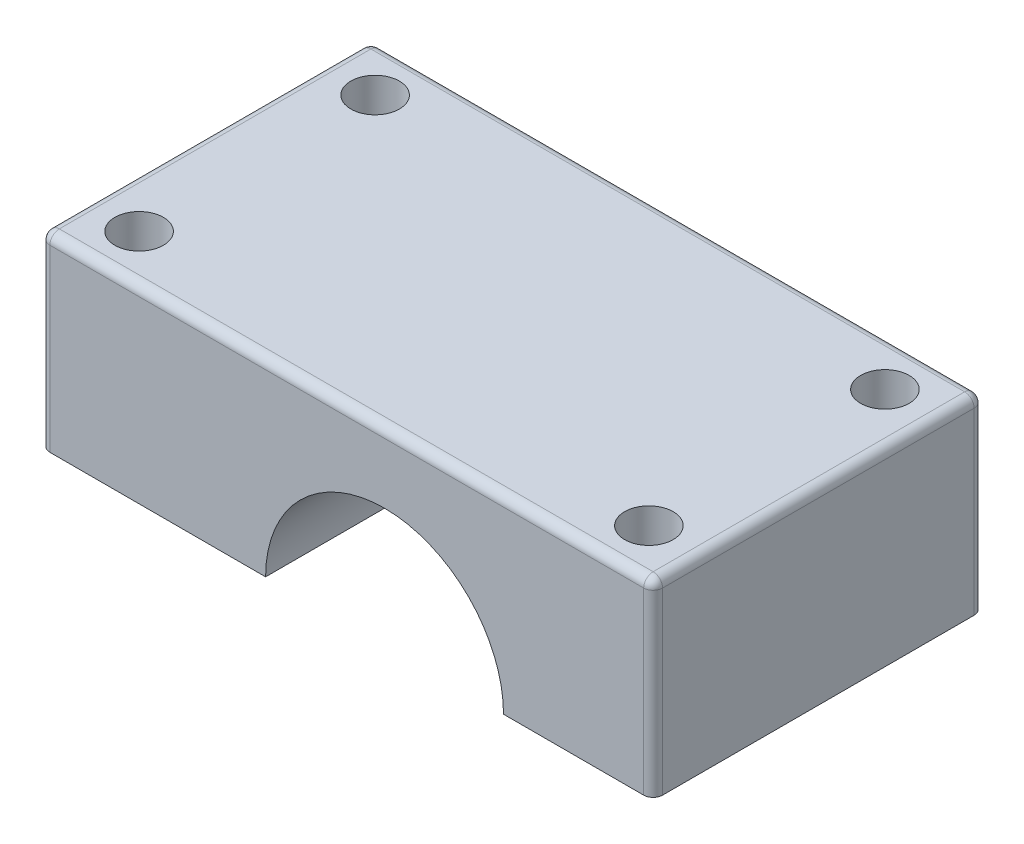
ISO-10303-21;
HEADER;
FILE_DESCRIPTION(('STEP AP214'),'2;1');
FILE_NAME('part.step','',(''),(''),'','','');
FILE_SCHEMA(('AUTOMOTIVE_DESIGN { 1 0 10303 214 1 1 1 1 }'));
ENDSEC;
DATA;
#1=APPLICATION_CONTEXT('core data for automotive mechanical design processes');
#2=APPLICATION_PROTOCOL_DEFINITION('international standard','automotive_design',2000,#1);
#3=PRODUCT_CONTEXT('',#1,'mechanical');
#4=PRODUCT('Part','Part','',(#3));
#5=PRODUCT_RELATED_PRODUCT_CATEGORY('part','',(#4));
#6=PRODUCT_DEFINITION_FORMATION('','',#4);
#7=PRODUCT_DEFINITION_CONTEXT('part definition',#1,'design');
#8=PRODUCT_DEFINITION('design','',#6,#7);
#9=PRODUCT_DEFINITION_SHAPE('','',#8);
#10=(LENGTH_UNIT() NAMED_UNIT(*) SI_UNIT(.MILLI.,.METRE.));
#11=(NAMED_UNIT(*) PLANE_ANGLE_UNIT() SI_UNIT($,.RADIAN.));
#12=(NAMED_UNIT(*) SI_UNIT($,.STERADIAN.) SOLID_ANGLE_UNIT());
#13=UNCERTAINTY_MEASURE_WITH_UNIT(LENGTH_MEASURE(1.E-05),#10,'distance_accuracy_value','');
#14=(GEOMETRIC_REPRESENTATION_CONTEXT(3) GLOBAL_UNCERTAINTY_ASSIGNED_CONTEXT((#13)) GLOBAL_UNIT_ASSIGNED_CONTEXT((#10,
#11,#12)) REPRESENTATION_CONTEXT('',''));
#15=CARTESIAN_POINT('',(0.,0.,0.));
#16=DIRECTION('',(0.,0.,1.));
#17=DIRECTION('',(1.,0.,0.));
#18=AXIS2_PLACEMENT_3D('',#15,#16,#17);
#19=CARTESIAN_POINT('',(0.,-12.7,0.));
#20=DIRECTION('',(0.,1.,0.));
#21=DIRECTION('',(0.,0.,1.));
#22=AXIS2_PLACEMENT_3D('',#19,#20,#21);
#23=PLANE('',#22);
#24=CARTESIAN_POINT('',(-39.37,-12.7,15.875));
#25=DIRECTION('',(0.,-1.,0.));
#26=DIRECTION('',(0.,0.,-1.));
#27=AXIS2_PLACEMENT_3D('',#24,#25,#26);
#28=CIRCLE('',#27,3.26389999999999);
#29=CARTESIAN_POINT('',(-39.37,-12.7,12.6111));
#30=VERTEX_POINT('',#29);
#31=EDGE_CURVE('E227',#30,#30,#28,.T.);
#32=ORIENTED_EDGE('',*,*,#31,.F.);
#33=EDGE_LOOP('',(#32));
#34=FACE_BOUND('',#33,.T.);
#35=CARTESIAN_POINT('',(-39.37,-12.7,-15.875));
#36=DIRECTION('',(0.,-1.,0.));
#37=DIRECTION('',(0.,0.,-1.));
#38=AXIS2_PLACEMENT_3D('',#35,#36,#37);
#39=CIRCLE('',#38,3.26389999999999);
#40=CARTESIAN_POINT('',(-39.37,-12.7,-19.1389));
#41=VERTEX_POINT('',#40);
#42=EDGE_CURVE('E251',#41,#41,#39,.T.);
#43=ORIENTED_EDGE('',*,*,#42,.F.);
#44=EDGE_LOOP('',(#43));
#45=FACE_BOUND('',#44,.T.);
#46=DIRECTION('',(0.,0.,1.));
#47=VECTOR('',#46,1.);
#48=CARTESIAN_POINT('',(-46.2915,-12.7,-22.225));
#49=LINE('',#48,#47);
#50=CARTESIAN_POINT('',(-46.2915,-12.7,-20.955));
#51=VERTEX_POINT('',#50);
#52=CARTESIAN_POINT('',(-46.2915,-12.7,20.955));
#53=VERTEX_POINT('',#52);
#54=EDGE_CURVE('E257',#51,#53,#49,.T.);
#55=ORIENTED_EDGE('',*,*,#54,.F.);
#56=CARTESIAN_POINT('',(-45.0215,-12.7,-20.955));
#57=DIRECTION('',(0.,1.,0.));
#58=DIRECTION('',(0.,0.,1.));
#59=AXIS2_PLACEMENT_3D('',#56,#57,#58);
#60=CIRCLE('',#59,1.27);
#61=CARTESIAN_POINT('',(-45.0215,-12.7,-22.225));
#62=VERTEX_POINT('',#61);
#63=EDGE_CURVE('E149',#51,#62,#60,.F.);
#64=ORIENTED_EDGE('',*,*,#63,.T.);
#65=DIRECTION('',(-1.,0.,0.));
#66=VECTOR('',#65,1.);
#67=CARTESIAN_POINT('',(-36.1315,-12.7,-22.225));
#68=LINE('',#67,#66);
#69=CARTESIAN_POINT('',(-16.002,-12.7,-22.225));
#70=VERTEX_POINT('',#69);
#71=EDGE_CURVE('E141',#70,#62,#68,.T.);
#72=ORIENTED_EDGE('',*,*,#71,.F.);
#73=DIRECTION('',(0.,0.,1.));
#74=VECTOR('',#73,1.);
#75=CARTESIAN_POINT('',(-16.002,-12.7,-22.225));
#76=LINE('',#75,#74);
#77=CARTESIAN_POINT('',(-16.002,-12.7,22.225));
#78=VERTEX_POINT('',#77);
#79=EDGE_CURVE('E126',#70,#78,#76,.T.);
#80=ORIENTED_EDGE('',*,*,#79,.T.);
#81=DIRECTION('',(1.,0.,0.));
#82=VECTOR('',#81,1.);
#83=CARTESIAN_POINT('',(-36.1315,-12.7,22.225));
#84=LINE('',#83,#82);
#85=CARTESIAN_POINT('',(-45.0215,-12.7,22.225));
#86=VERTEX_POINT('',#85);
#87=EDGE_CURVE('E156',#86,#78,#84,.T.);
#88=ORIENTED_EDGE('',*,*,#87,.F.);
#89=CARTESIAN_POINT('',(-45.0215,-12.7,20.955));
#90=DIRECTION('',(0.,1.,0.));
#91=DIRECTION('',(0.,0.,1.));
#92=AXIS2_PLACEMENT_3D('',#89,#90,#91);
#93=CIRCLE('',#92,1.27);
#94=EDGE_CURVE('E180',#86,#53,#93,.F.);
#95=ORIENTED_EDGE('',*,*,#94,.T.);
#96=EDGE_LOOP('',(#55,#64,#72,#80,#88,#95));
#97=FACE_BOUND('',#96,.T.);
#98=ADVANCED_FACE('F34',(#34,#45,#97),#23,.F.);
#99=CARTESIAN_POINT('',(36.1315,12.7,-22.225));
#100=DIRECTION('',(-1.,0.,0.));
#101=DIRECTION('',(0.,0.,1.));
#102=AXIS2_PLACEMENT_3D('',#99,#100,#101);
#103=PLANE('',#102);
#104=DIRECTION('',(0.,0.,-1.));
#105=VECTOR('',#104,1.);
#106=CARTESIAN_POINT('',(36.1315,-12.7,-22.225));
#107=LINE('',#106,#105);
#108=CARTESIAN_POINT('',(36.1315,-12.7,20.955));
#109=VERTEX_POINT('',#108);
#110=CARTESIAN_POINT('',(36.1315,-12.7,-20.955));
#111=VERTEX_POINT('',#110);
#112=EDGE_CURVE('E150',#109,#111,#107,.T.);
#113=ORIENTED_EDGE('',*,*,#112,.T.);
#114=DIRECTION('',(0.,-1.,0.));
#115=VECTOR('',#114,1.);
#116=CARTESIAN_POINT('',(36.1315,12.7,-20.955));
#117=LINE('',#116,#115);
#118=CARTESIAN_POINT('',(36.1315,11.43,-20.955));
#119=VERTEX_POINT('',#118);
#120=EDGE_CURVE('E172',#111,#119,#117,.F.);
#121=ORIENTED_EDGE('',*,*,#120,.T.);
#122=DIRECTION('',(0.,0.,-1.));
#123=VECTOR('',#122,1.);
#124=CARTESIAN_POINT('',(36.1315,11.43,22.225));
#125=LINE('',#124,#123);
#126=CARTESIAN_POINT('',(36.1315,11.43,20.955));
#127=VERTEX_POINT('',#126);
#128=EDGE_CURVE('E168',#119,#127,#125,.F.);
#129=ORIENTED_EDGE('',*,*,#128,.T.);
#130=DIRECTION('',(0.,-1.,0.));
#131=VECTOR('',#130,1.);
#132=CARTESIAN_POINT('',(36.1315,12.7,20.955));
#133=LINE('',#132,#131);
#134=EDGE_CURVE('E170',#127,#109,#133,.T.);
#135=ORIENTED_EDGE('',*,*,#134,.T.);
#136=EDGE_LOOP('',(#113,#121,#129,#135));
#137=FACE_BOUND('',#136,.T.);
#138=ADVANCED_FACE('F307',(#137),#103,.F.);
#139=CARTESIAN_POINT('',(-36.1315,12.7,-22.225));
#140=DIRECTION('',(0.,0.,1.));
#141=DIRECTION('',(1.,0.,0.));
#142=AXIS2_PLACEMENT_3D('',#139,#140,#141);
#143=PLANE('',#142);
#144=DIRECTION('',(-1.,0.,0.));
#145=VECTOR('',#144,1.);
#146=CARTESIAN_POINT('',(36.1315,11.43,-22.225));
#147=LINE('',#146,#145);
#148=CARTESIAN_POINT('',(-45.0215,11.43,-22.225));
#149=VERTEX_POINT('',#148);
#150=CARTESIAN_POINT('',(34.8615,11.43,-22.225));
#151=VERTEX_POINT('',#150);
#152=EDGE_CURVE('E158',#149,#151,#147,.F.);
#153=ORIENTED_EDGE('',*,*,#152,.T.);
#154=DIRECTION('',(0.,-1.,0.));
#155=VECTOR('',#154,1.);
#156=CARTESIAN_POINT('',(34.8615,12.7,-22.225));
#157=LINE('',#156,#155);
#158=CARTESIAN_POINT('',(34.8615,-12.7,-22.225));
#159=VERTEX_POINT('',#158);
#160=EDGE_CURVE('E162',#151,#159,#157,.T.);
#161=ORIENTED_EDGE('',*,*,#160,.T.);
#162=CARTESIAN_POINT('',(16.002,-12.7,-22.225));
#163=VERTEX_POINT('',#162);
#164=EDGE_CURVE('E145',#159,#163,#68,.T.);
#165=ORIENTED_EDGE('',*,*,#164,.T.);
#166=CARTESIAN_POINT('',(0.,-12.7,-22.225));
#167=DIRECTION('',(0.,0.,1.));
#168=DIRECTION('',(-1.,0.,0.));
#169=AXIS2_PLACEMENT_3D('',#166,#167,#168);
#170=CIRCLE('',#169,16.002);
#171=EDGE_CURVE('E129',#163,#70,#170,.T.);
#172=ORIENTED_EDGE('',*,*,#171,.T.);
#173=ORIENTED_EDGE('',*,*,#71,.T.);
#174=DIRECTION('',(0.,-1.,0.));
#175=VECTOR('',#174,1.);
#176=CARTESIAN_POINT('',(-45.0215,12.7,-22.225));
#177=LINE('',#176,#175);
#178=EDGE_CURVE('E160',#62,#149,#177,.F.);
#179=ORIENTED_EDGE('',*,*,#178,.T.);
#180=EDGE_LOOP('',(#153,#161,#165,#172,#173,#179));
#181=FACE_BOUND('',#180,.T.);
#182=ADVANCED_FACE('F140',(#181),#143,.F.);
#183=CARTESIAN_POINT('',(-36.1315,12.7,22.225));
#184=DIRECTION('',(0.,0.,-1.));
#185=DIRECTION('',(-1.,0.,0.));
#186=AXIS2_PLACEMENT_3D('',#183,#184,#185);
#187=PLANE('',#186);
#188=DIRECTION('',(1.,0.,0.));
#189=VECTOR('',#188,1.);
#190=CARTESIAN_POINT('',(-46.2915,11.43,22.225));
#191=LINE('',#190,#189);
#192=CARTESIAN_POINT('',(34.8615,11.43,22.225));
#193=VERTEX_POINT('',#192);
#194=CARTESIAN_POINT('',(-45.0215,11.43,22.225));
#195=VERTEX_POINT('',#194);
#196=EDGE_CURVE('E183',#193,#195,#191,.F.);
#197=ORIENTED_EDGE('',*,*,#196,.T.);
#198=DIRECTION('',(0.,1.,0.));
#199=VECTOR('',#198,1.);
#200=CARTESIAN_POINT('',(-45.0215,-12.7,22.225));
#201=LINE('',#200,#199);
#202=EDGE_CURVE('E187',#195,#86,#201,.F.);
#203=ORIENTED_EDGE('',*,*,#202,.T.);
#204=ORIENTED_EDGE('',*,*,#87,.T.);
#205=CARTESIAN_POINT('',(0.,-12.7,22.225));
#206=DIRECTION('',(0.,0.,1.));
#207=DIRECTION('',(-1.,0.,0.));
#208=AXIS2_PLACEMENT_3D('',#205,#206,#207);
#209=CIRCLE('',#208,16.002);
#210=CARTESIAN_POINT('',(16.002,-12.7,22.225));
#211=VERTEX_POINT('',#210);
#212=EDGE_CURVE('E132',#211,#78,#209,.T.);
#213=ORIENTED_EDGE('',*,*,#212,.F.);
#214=CARTESIAN_POINT('',(34.8615,-12.7,22.225));
#215=VERTEX_POINT('',#214);
#216=EDGE_CURVE('E152',#211,#215,#84,.T.);
#217=ORIENTED_EDGE('',*,*,#216,.T.);
#218=DIRECTION('',(0.,-1.,0.));
#219=VECTOR('',#218,1.);
#220=CARTESIAN_POINT('',(34.8615,12.7,22.225));
#221=LINE('',#220,#219);
#222=EDGE_CURVE('E185',#215,#193,#221,.F.);
#223=ORIENTED_EDGE('',*,*,#222,.T.);
#224=EDGE_LOOP('',(#197,#203,#204,#213,#217,#223));
#225=FACE_BOUND('',#224,.T.);
#226=ADVANCED_FACE('F265',(#225),#187,.F.);
#227=CARTESIAN_POINT('',(0.,12.7,0.));
#228=DIRECTION('',(0.,1.,0.));
#229=DIRECTION('',(0.,0.,1.));
#230=AXIS2_PLACEMENT_3D('',#227,#228,#229);
#231=PLANE('',#230);
#232=DIRECTION('',(0.,0.,-1.));
#233=VECTOR('',#232,1.);
#234=CARTESIAN_POINT('',(34.8615,12.7,-22.225));
#235=LINE('',#234,#233);
#236=CARTESIAN_POINT('',(34.8615,12.7,20.955));
#237=VERTEX_POINT('',#236);
#238=CARTESIAN_POINT('',(34.8615,12.7,-20.955));
#239=VERTEX_POINT('',#238);
#240=EDGE_CURVE('E43',#237,#239,#235,.T.);
#241=ORIENTED_EDGE('',*,*,#240,.T.);
#242=DIRECTION('',(-1.,0.,0.));
#243=VECTOR('',#242,1.);
#244=CARTESIAN_POINT('',(-46.2915,12.7,-20.955));
#245=LINE('',#244,#243);
#246=CARTESIAN_POINT('',(-45.0215,12.7,-20.955));
#247=VERTEX_POINT('',#246);
#248=EDGE_CURVE('E11',#239,#247,#245,.T.);
#249=ORIENTED_EDGE('',*,*,#248,.T.);
#250=DIRECTION('',(0.,0.,-1.));
#251=VECTOR('',#250,1.);
#252=CARTESIAN_POINT('',(-45.0215,12.7,0.));
#253=LINE('',#252,#251);
#254=CARTESIAN_POINT('',(-45.0215,12.7,20.955));
#255=VERTEX_POINT('',#254);
#256=EDGE_CURVE('E191',#247,#255,#253,.F.);
#257=ORIENTED_EDGE('',*,*,#256,.T.);
#258=DIRECTION('',(1.,0.,0.));
#259=VECTOR('',#258,1.);
#260=CARTESIAN_POINT('',(36.1315,12.7,20.955));
#261=LINE('',#260,#259);
#262=EDGE_CURVE('E189',#255,#237,#261,.T.);
#263=ORIENTED_EDGE('',*,*,#262,.T.);
#264=EDGE_LOOP('',(#241,#249,#257,#263));
#265=FACE_BOUND('',#264,.T.);
#266=CARTESIAN_POINT('',(-39.37,12.7,15.875));
#267=DIRECTION('',(0.,-1.,0.));
#268=DIRECTION('',(0.,0.,-1.));
#269=AXIS2_PLACEMENT_3D('',#266,#267,#268);
#270=CIRCLE('',#269,3.26389999999999);
#271=CARTESIAN_POINT('',(-39.37,12.7,12.6111));
#272=VERTEX_POINT('',#271);
#273=EDGE_CURVE('E232',#272,#272,#270,.T.);
#274=ORIENTED_EDGE('',*,*,#273,.T.);
#275=EDGE_LOOP('',(#274));
#276=FACE_BOUND('',#275,.T.);
#277=CARTESIAN_POINT('',(29.21,12.7,15.875));
#278=DIRECTION('',(0.,-1.,0.));
#279=DIRECTION('',(0.,0.,-1.));
#280=AXIS2_PLACEMENT_3D('',#277,#278,#279);
#281=CIRCLE('',#280,3.26389999999999);
#282=CARTESIAN_POINT('',(29.21,12.7,12.6111));
#283=VERTEX_POINT('',#282);
#284=EDGE_CURVE('E242',#283,#283,#281,.T.);
#285=ORIENTED_EDGE('',*,*,#284,.T.);
#286=EDGE_LOOP('',(#285));
#287=FACE_BOUND('',#286,.T.);
#288=CARTESIAN_POINT('',(29.21,12.7,-15.875));
#289=DIRECTION('',(0.,-1.,0.));
#290=DIRECTION('',(0.,0.,-1.));
#291=AXIS2_PLACEMENT_3D('',#288,#289,#290);
#292=CIRCLE('',#291,3.26389999999999);
#293=CARTESIAN_POINT('',(29.21,12.7,-19.1389));
#294=VERTEX_POINT('',#293);
#295=EDGE_CURVE('E248',#294,#294,#292,.T.);
#296=ORIENTED_EDGE('',*,*,#295,.T.);
#297=EDGE_LOOP('',(#296));
#298=FACE_BOUND('',#297,.T.);
#299=CARTESIAN_POINT('',(-39.37,12.7,-15.875));
#300=DIRECTION('',(0.,-1.,0.));
#301=DIRECTION('',(0.,0.,-1.));
#302=AXIS2_PLACEMENT_3D('',#299,#300,#301);
#303=CIRCLE('',#302,3.26389999999999);
#304=CARTESIAN_POINT('',(-39.37,12.7,-19.1389));
#305=VERTEX_POINT('',#304);
#306=EDGE_CURVE('E254',#305,#305,#303,.T.);
#307=ORIENTED_EDGE('',*,*,#306,.T.);
#308=EDGE_LOOP('',(#307));
#309=FACE_BOUND('',#308,.T.);
#310=ADVANCED_FACE('F290',(#265,#276,#287,#298,#309),#231,.T.);
#311=CARTESIAN_POINT('',(29.21,-12.7,15.875));
#312=DIRECTION('',(0.,-1.,0.));
#313=DIRECTION('',(0.,0.,-1.));
#314=AXIS2_PLACEMENT_3D('',#311,#312,#313);
#315=CIRCLE('',#314,3.26389999999999);
#316=CARTESIAN_POINT('',(29.21,-12.7,12.6111));
#317=VERTEX_POINT('',#316);
#318=EDGE_CURVE('E237',#317,#317,#315,.T.);
#319=ORIENTED_EDGE('',*,*,#318,.F.);
#320=EDGE_LOOP('',(#319));
#321=FACE_BOUND('',#320,.T.);
#322=CARTESIAN_POINT('',(29.21,-12.7,-15.875));
#323=DIRECTION('',(0.,-1.,0.));
#324=DIRECTION('',(0.,0.,-1.));
#325=AXIS2_PLACEMENT_3D('',#322,#323,#324);
#326=CIRCLE('',#325,3.26389999999999);
#327=CARTESIAN_POINT('',(29.21,-12.7,-19.1389));
#328=VERTEX_POINT('',#327);
#329=EDGE_CURVE('E245',#328,#328,#326,.T.);
#330=ORIENTED_EDGE('',*,*,#329,.F.);
#331=EDGE_LOOP('',(#330));
#332=FACE_BOUND('',#331,.T.);
#333=ORIENTED_EDGE('',*,*,#164,.F.);
#334=CARTESIAN_POINT('',(34.8615,-12.7,-20.955));
#335=DIRECTION('',(0.,1.,0.));
#336=DIRECTION('',(0.,0.,1.));
#337=AXIS2_PLACEMENT_3D('',#334,#335,#336);
#338=CIRCLE('',#337,1.27);
#339=EDGE_CURVE('E166',#159,#111,#338,.F.);
#340=ORIENTED_EDGE('',*,*,#339,.T.);
#341=ORIENTED_EDGE('',*,*,#112,.F.);
#342=CARTESIAN_POINT('',(34.8615,-12.7,20.955));
#343=DIRECTION('',(0.,1.,0.));
#344=DIRECTION('',(0.,0.,1.));
#345=AXIS2_PLACEMENT_3D('',#342,#343,#344);
#346=CIRCLE('',#345,1.27);
#347=EDGE_CURVE('E164',#109,#215,#346,.F.);
#348=ORIENTED_EDGE('',*,*,#347,.T.);
#349=ORIENTED_EDGE('',*,*,#216,.F.);
#350=DIRECTION('',(0.,0.,1.));
#351=VECTOR('',#350,1.);
#352=CARTESIAN_POINT('',(16.002,-12.7,-22.225));
#353=LINE('',#352,#351);
#354=EDGE_CURVE('E136',#163,#211,#353,.T.);
#355=ORIENTED_EDGE('',*,*,#354,.F.);
#356=EDGE_LOOP('',(#333,#340,#341,#348,#349,#355));
#357=FACE_BOUND('',#356,.T.);
#358=ADVANCED_FACE('F267',(#321,#332,#357),#23,.F.);
#359=CARTESIAN_POINT('',(0.,-12.7,-22.225));
#360=DIRECTION('',(0.,0.,1.));
#361=DIRECTION('',(1.,0.,0.));
#362=AXIS2_PLACEMENT_3D('',#359,#360,#361);
#363=CYLINDRICAL_SURFACE('',#362,16.002);
#364=ORIENTED_EDGE('',*,*,#212,.T.);
#365=ORIENTED_EDGE('',*,*,#79,.F.);
#366=ORIENTED_EDGE('',*,*,#171,.F.);
#367=ORIENTED_EDGE('',*,*,#354,.T.);
#368=EDGE_LOOP('',(#364,#365,#366,#367));
#369=FACE_BOUND('',#368,.T.);
#370=ADVANCED_FACE('F128',(#369),#363,.F.);
#371=CARTESIAN_POINT('',(-46.2915,0.,0.));
#372=DIRECTION('',(-1.,0.,0.));
#373=DIRECTION('',(0.,0.,1.));
#374=AXIS2_PLACEMENT_3D('',#371,#372,#373);
#375=PLANE('',#374);
#376=DIRECTION('',(0.,0.,-1.));
#377=VECTOR('',#376,1.);
#378=CARTESIAN_POINT('',(-46.2915,11.43,0.));
#379=LINE('',#378,#377);
#380=CARTESIAN_POINT('',(-46.2915,11.43,20.955));
#381=VERTEX_POINT('',#380);
#382=CARTESIAN_POINT('',(-46.2915,11.43,-20.955));
#383=VERTEX_POINT('',#382);
#384=EDGE_CURVE('E174',#381,#383,#379,.T.);
#385=ORIENTED_EDGE('',*,*,#384,.T.);
#386=DIRECTION('',(0.,-1.,0.));
#387=VECTOR('',#386,1.);
#388=CARTESIAN_POINT('',(-46.2915,-12.7,-20.955));
#389=LINE('',#388,#387);
#390=EDGE_CURVE('E178',#383,#51,#389,.T.);
#391=ORIENTED_EDGE('',*,*,#390,.T.);
#392=ORIENTED_EDGE('',*,*,#54,.T.);
#393=DIRECTION('',(0.,1.,0.));
#394=VECTOR('',#393,1.);
#395=CARTESIAN_POINT('',(-46.2915,12.7,20.955));
#396=LINE('',#395,#394);
#397=EDGE_CURVE('E176',#53,#381,#396,.T.);
#398=ORIENTED_EDGE('',*,*,#397,.T.);
#399=EDGE_LOOP('',(#385,#391,#392,#398));
#400=FACE_BOUND('',#399,.T.);
#401=ADVANCED_FACE('F324',(#400),#375,.T.);
#402=CARTESIAN_POINT('',(-39.37,-12.7,-15.875));
#403=DIRECTION('',(0.,-1.,0.));
#404=DIRECTION('',(0.,0.,-1.));
#405=AXIS2_PLACEMENT_3D('',#402,#403,#404);
#406=CYLINDRICAL_SURFACE('',#405,3.26389999999999);
#407=ORIENTED_EDGE('',*,*,#306,.F.);
#408=EDGE_LOOP('',(#407));
#409=FACE_BOUND('',#408,.T.);
#410=ORIENTED_EDGE('',*,*,#42,.T.);
#411=EDGE_LOOP('',(#410));
#412=FACE_BOUND('',#411,.T.);
#413=ADVANCED_FACE('F333',(#409,#412),#406,.F.);
#414=CARTESIAN_POINT('',(29.21,-12.7,-15.875));
#415=DIRECTION('',(0.,-1.,0.));
#416=DIRECTION('',(0.,0.,-1.));
#417=AXIS2_PLACEMENT_3D('',#414,#415,#416);
#418=CYLINDRICAL_SURFACE('',#417,3.26389999999999);
#419=ORIENTED_EDGE('',*,*,#295,.F.);
#420=EDGE_LOOP('',(#419));
#421=FACE_BOUND('',#420,.T.);
#422=ORIENTED_EDGE('',*,*,#329,.T.);
#423=EDGE_LOOP('',(#422));
#424=FACE_BOUND('',#423,.T.);
#425=ADVANCED_FACE('F330',(#421,#424),#418,.F.);
#426=CARTESIAN_POINT('',(29.21,-12.7,15.875));
#427=DIRECTION('',(0.,-1.,0.));
#428=DIRECTION('',(0.,0.,-1.));
#429=AXIS2_PLACEMENT_3D('',#426,#427,#428);
#430=CYLINDRICAL_SURFACE('',#429,3.26389999999999);
#431=ORIENTED_EDGE('',*,*,#284,.F.);
#432=EDGE_LOOP('',(#431));
#433=FACE_BOUND('',#432,.T.);
#434=ORIENTED_EDGE('',*,*,#318,.T.);
#435=EDGE_LOOP('',(#434));
#436=FACE_BOUND('',#435,.T.);
#437=ADVANCED_FACE('F332',(#433,#436),#430,.F.);
#438=CARTESIAN_POINT('',(-39.37,-12.7,15.875));
#439=DIRECTION('',(0.,-1.,0.));
#440=DIRECTION('',(0.,0.,-1.));
#441=AXIS2_PLACEMENT_3D('',#438,#439,#440);
#442=CYLINDRICAL_SURFACE('',#441,3.26389999999999);
#443=ORIENTED_EDGE('',*,*,#273,.F.);
#444=EDGE_LOOP('',(#443));
#445=FACE_BOUND('',#444,.T.);
#446=ORIENTED_EDGE('',*,*,#31,.T.);
#447=EDGE_LOOP('',(#446));
#448=FACE_BOUND('',#447,.T.);
#449=ADVANCED_FACE('F304',(#445,#448),#442,.F.);
#450=CARTESIAN_POINT('',(-45.0215,0.,20.955));
#451=DIRECTION('',(0.,-1.,0.));
#452=DIRECTION('',(0.,0.,-1.));
#453=AXIS2_PLACEMENT_3D('',#450,#451,#452);
#454=CYLINDRICAL_SURFACE('',#453,1.27);
#455=CARTESIAN_POINT('',(-45.0215,11.43,20.955));
#456=DIRECTION('',(0.,1.,0.));
#457=DIRECTION('',(0.,0.,1.));
#458=AXIS2_PLACEMENT_3D('',#455,#456,#457);
#459=CIRCLE('',#458,1.27);
#460=EDGE_CURVE('E38',#381,#195,#459,.T.);
#461=ORIENTED_EDGE('',*,*,#460,.F.);
#462=ORIENTED_EDGE('',*,*,#397,.F.);
#463=ORIENTED_EDGE('',*,*,#94,.F.);
#464=ORIENTED_EDGE('',*,*,#202,.F.);
#465=EDGE_LOOP('',(#461,#462,#463,#464));
#466=FACE_BOUND('',#465,.T.);
#467=ADVANCED_FACE('F36',(#466),#454,.T.);
#468=CARTESIAN_POINT('',(-45.0215,11.43,20.955));
#469=DIRECTION('',(0.,0.,1.));
#470=DIRECTION('',(1.,0.,0.));
#471=AXIS2_PLACEMENT_3D('',#468,#469,#470);
#472=SPHERICAL_SURFACE('',#471,1.27);
#473=CARTESIAN_POINT('',(-45.0215,11.43,20.955));
#474=DIRECTION('',(0.,0.,1.));
#475=DIRECTION('',(1.,0.,0.));
#476=AXIS2_PLACEMENT_3D('',#473,#474,#475);
#477=CIRCLE('',#476,1.27);
#478=EDGE_CURVE('E218',#381,#255,#477,.F.);
#479=ORIENTED_EDGE('',*,*,#478,.F.);
#480=ORIENTED_EDGE('',*,*,#460,.T.);
#481=CARTESIAN_POINT('',(-45.0215,11.43,20.955));
#482=DIRECTION('',(-1.,0.,0.));
#483=DIRECTION('',(0.,0.,1.));
#484=AXIS2_PLACEMENT_3D('',#481,#482,#483);
#485=CIRCLE('',#484,1.27);
#486=EDGE_CURVE('E220',#255,#195,#485,.F.);
#487=ORIENTED_EDGE('',*,*,#486,.F.);
#488=EDGE_LOOP('',(#479,#480,#487));
#489=FACE_BOUND('',#488,.T.);
#490=ADVANCED_FACE('F297',(#489),#472,.T.);
#491=CARTESIAN_POINT('',(34.8615,12.7,20.955));
#492=DIRECTION('',(0.,-1.,0.));
#493=DIRECTION('',(0.,0.,-1.));
#494=AXIS2_PLACEMENT_3D('',#491,#492,#493);
#495=CYLINDRICAL_SURFACE('',#494,1.27);
#496=ORIENTED_EDGE('',*,*,#347,.F.);
#497=ORIENTED_EDGE('',*,*,#134,.F.);
#498=CARTESIAN_POINT('',(34.8615,11.43,20.955));
#499=DIRECTION('',(0.,1.,0.));
#500=DIRECTION('',(0.,0.,1.));
#501=AXIS2_PLACEMENT_3D('',#498,#499,#500);
#502=CIRCLE('',#501,1.27);
#503=EDGE_CURVE('E215',#193,#127,#502,.T.);
#504=ORIENTED_EDGE('',*,*,#503,.F.);
#505=ORIENTED_EDGE('',*,*,#222,.F.);
#506=EDGE_LOOP('',(#496,#497,#504,#505));
#507=FACE_BOUND('',#506,.T.);
#508=ADVANCED_FACE('F272',(#507),#495,.T.);
#509=CARTESIAN_POINT('',(0.,11.43,20.955));
#510=DIRECTION('',(-1.,0.,0.));
#511=DIRECTION('',(0.,0.,1.));
#512=AXIS2_PLACEMENT_3D('',#509,#510,#511);
#513=CYLINDRICAL_SURFACE('',#512,1.27);
#514=ORIENTED_EDGE('',*,*,#486,.T.);
#515=ORIENTED_EDGE('',*,*,#196,.F.);
#516=CARTESIAN_POINT('',(34.8615,11.43,20.955));
#517=DIRECTION('',(1.,0.,0.));
#518=DIRECTION('',(0.,0.,-1.));
#519=AXIS2_PLACEMENT_3D('',#516,#517,#518);
#520=CIRCLE('',#519,1.27);
#521=EDGE_CURVE('E212',#237,#193,#520,.T.);
#522=ORIENTED_EDGE('',*,*,#521,.F.);
#523=ORIENTED_EDGE('',*,*,#262,.F.);
#524=EDGE_LOOP('',(#514,#515,#522,#523));
#525=FACE_BOUND('',#524,.T.);
#526=ADVANCED_FACE('F276',(#525),#513,.T.);
#527=CARTESIAN_POINT('',(-45.0215,11.43,0.));
#528=DIRECTION('',(0.,0.,-1.));
#529=DIRECTION('',(-1.,0.,0.));
#530=AXIS2_PLACEMENT_3D('',#527,#528,#529);
#531=CYLINDRICAL_SURFACE('',#530,1.27);
#532=ORIENTED_EDGE('',*,*,#478,.T.);
#533=ORIENTED_EDGE('',*,*,#256,.F.);
#534=CARTESIAN_POINT('',(-45.0215,11.43,-20.955));
#535=DIRECTION('',(0.,0.,-1.));
#536=DIRECTION('',(-1.,0.,0.));
#537=AXIS2_PLACEMENT_3D('',#534,#535,#536);
#538=CIRCLE('',#537,1.27);
#539=EDGE_CURVE('E210',#383,#247,#538,.T.);
#540=ORIENTED_EDGE('',*,*,#539,.F.);
#541=ORIENTED_EDGE('',*,*,#384,.F.);
#542=EDGE_LOOP('',(#532,#533,#540,#541));
#543=FACE_BOUND('',#542,.T.);
#544=ADVANCED_FACE('F296',(#543),#531,.T.);
#545=CARTESIAN_POINT('',(-45.0215,0.,-20.955));
#546=DIRECTION('',(0.,1.,0.));
#547=DIRECTION('',(0.,0.,1.));
#548=AXIS2_PLACEMENT_3D('',#545,#546,#547);
#549=CYLINDRICAL_SURFACE('',#548,1.27);
#550=ORIENTED_EDGE('',*,*,#63,.F.);
#551=ORIENTED_EDGE('',*,*,#390,.F.);
#552=CARTESIAN_POINT('',(-45.0215,11.43,-20.955));
#553=DIRECTION('',(0.,1.,0.));
#554=DIRECTION('',(0.,0.,1.));
#555=AXIS2_PLACEMENT_3D('',#552,#553,#554);
#556=CIRCLE('',#555,1.27);
#557=EDGE_CURVE('E207',#149,#383,#556,.T.);
#558=ORIENTED_EDGE('',*,*,#557,.F.);
#559=ORIENTED_EDGE('',*,*,#178,.F.);
#560=EDGE_LOOP('',(#550,#551,#558,#559));
#561=FACE_BOUND('',#560,.T.);
#562=ADVANCED_FACE('F355',(#561),#549,.T.);
#563=CARTESIAN_POINT('',(34.8615,11.43,20.955));
#564=DIRECTION('',(0.,0.,1.));
#565=DIRECTION('',(1.,0.,0.));
#566=AXIS2_PLACEMENT_3D('',#563,#564,#565);
#567=SPHERICAL_SURFACE('',#566,1.27);
#568=ORIENTED_EDGE('',*,*,#521,.T.);
#569=ORIENTED_EDGE('',*,*,#503,.T.);
#570=CARTESIAN_POINT('',(34.8615,11.43,20.955));
#571=DIRECTION('',(0.,0.,1.));
#572=DIRECTION('',(1.,0.,0.));
#573=AXIS2_PLACEMENT_3D('',#570,#571,#572);
#574=CIRCLE('',#573,1.27);
#575=EDGE_CURVE('E204',#237,#127,#574,.F.);
#576=ORIENTED_EDGE('',*,*,#575,.F.);
#577=EDGE_LOOP('',(#568,#569,#576));
#578=FACE_BOUND('',#577,.T.);
#579=ADVANCED_FACE('F279',(#578),#567,.T.);
#580=CARTESIAN_POINT('',(-45.0215,11.43,-20.955));
#581=DIRECTION('',(0.,0.,1.));
#582=DIRECTION('',(1.,0.,0.));
#583=AXIS2_PLACEMENT_3D('',#580,#581,#582);
#584=SPHERICAL_SURFACE('',#583,1.27);
#585=ORIENTED_EDGE('',*,*,#557,.T.);
#586=ORIENTED_EDGE('',*,*,#539,.T.);
#587=CARTESIAN_POINT('',(-45.0215,11.43,-20.955));
#588=DIRECTION('',(-1.,0.,0.));
#589=DIRECTION('',(0.,0.,1.));
#590=AXIS2_PLACEMENT_3D('',#587,#588,#589);
#591=CIRCLE('',#590,1.27);
#592=EDGE_CURVE('E56',#149,#247,#591,.F.);
#593=ORIENTED_EDGE('',*,*,#592,.F.);
#594=EDGE_LOOP('',(#585,#586,#593));
#595=FACE_BOUND('',#594,.T.);
#596=ADVANCED_FACE('F357',(#595),#584,.T.);
#597=CARTESIAN_POINT('',(34.8615,11.43,0.));
#598=DIRECTION('',(0.,0.,1.));
#599=DIRECTION('',(1.,0.,0.));
#600=AXIS2_PLACEMENT_3D('',#597,#598,#599);
#601=CYLINDRICAL_SURFACE('',#600,1.27);
#602=ORIENTED_EDGE('',*,*,#575,.T.);
#603=ORIENTED_EDGE('',*,*,#128,.F.);
#604=CARTESIAN_POINT('',(34.8615,11.43,-20.955));
#605=DIRECTION('',(0.,0.,-1.));
#606=DIRECTION('',(-1.,0.,0.));
#607=AXIS2_PLACEMENT_3D('',#604,#605,#606);
#608=CIRCLE('',#607,1.27);
#609=EDGE_CURVE('E200',#239,#119,#608,.T.);
#610=ORIENTED_EDGE('',*,*,#609,.F.);
#611=ORIENTED_EDGE('',*,*,#240,.F.);
#612=EDGE_LOOP('',(#602,#603,#610,#611));
#613=FACE_BOUND('',#612,.T.);
#614=ADVANCED_FACE('F283',(#613),#601,.T.);
#615=CARTESIAN_POINT('',(0.,11.43,-20.955));
#616=DIRECTION('',(1.,0.,0.));
#617=DIRECTION('',(0.,0.,-1.));
#618=AXIS2_PLACEMENT_3D('',#615,#616,#617);
#619=CYLINDRICAL_SURFACE('',#618,1.27);
#620=ORIENTED_EDGE('',*,*,#592,.T.);
#621=ORIENTED_EDGE('',*,*,#248,.F.);
#622=CARTESIAN_POINT('',(34.8615,11.43,-20.955));
#623=DIRECTION('',(1.,0.,0.));
#624=DIRECTION('',(0.,1.,0.));
#625=AXIS2_PLACEMENT_3D('',#622,#623,#624);
#626=CIRCLE('',#625,1.27);
#627=EDGE_CURVE('E197',#151,#239,#626,.T.);
#628=ORIENTED_EDGE('',*,*,#627,.F.);
#629=ORIENTED_EDGE('',*,*,#152,.F.);
#630=EDGE_LOOP('',(#620,#621,#628,#629));
#631=FACE_BOUND('',#630,.T.);
#632=ADVANCED_FACE('F289',(#631),#619,.T.);
#633=CARTESIAN_POINT('',(34.8615,11.43,-20.955));
#634=DIRECTION('',(0.,0.,1.));
#635=DIRECTION('',(1.,0.,0.));
#636=AXIS2_PLACEMENT_3D('',#633,#634,#635);
#637=SPHERICAL_SURFACE('',#636,1.27);
#638=ORIENTED_EDGE('',*,*,#627,.T.);
#639=ORIENTED_EDGE('',*,*,#609,.T.);
#640=CARTESIAN_POINT('',(34.8615,11.43,-20.955));
#641=DIRECTION('',(0.,1.,0.));
#642=DIRECTION('',(0.,0.,1.));
#643=AXIS2_PLACEMENT_3D('',#640,#641,#642);
#644=CIRCLE('',#643,1.27);
#645=EDGE_CURVE('E194',#151,#119,#644,.F.);
#646=ORIENTED_EDGE('',*,*,#645,.F.);
#647=EDGE_LOOP('',(#638,#639,#646));
#648=FACE_BOUND('',#647,.T.);
#649=ADVANCED_FACE('F287',(#648),#637,.T.);
#650=CARTESIAN_POINT('',(34.8615,12.7,-20.955));
#651=DIRECTION('',(0.,-1.,0.));
#652=DIRECTION('',(0.,0.,-1.));
#653=AXIS2_PLACEMENT_3D('',#650,#651,#652);
#654=CYLINDRICAL_SURFACE('',#653,1.27);
#655=ORIENTED_EDGE('',*,*,#645,.T.);
#656=ORIENTED_EDGE('',*,*,#120,.F.);
#657=ORIENTED_EDGE('',*,*,#339,.F.);
#658=ORIENTED_EDGE('',*,*,#160,.F.);
#659=EDGE_LOOP('',(#655,#656,#657,#658));
#660=FACE_BOUND('',#659,.T.);
#661=ADVANCED_FACE('F415',(#660),#654,.T.);
#662=CLOSED_SHELL('',(#98,#138,#182,#226,#310,#358,#370,#401,#413,#425,#437,#449,#467,#490,#508,
#526,#544,#562,#579,#596,#614,#632,#649,#661));
#663=MANIFOLD_SOLID_BREP('B2',#662);
#664=ADVANCED_BREP_SHAPE_REPRESENTATION('',(#18,#663),#14);
#665=SHAPE_DEFINITION_REPRESENTATION(#9,#664);
ENDSEC;
END-ISO-10303-21;
